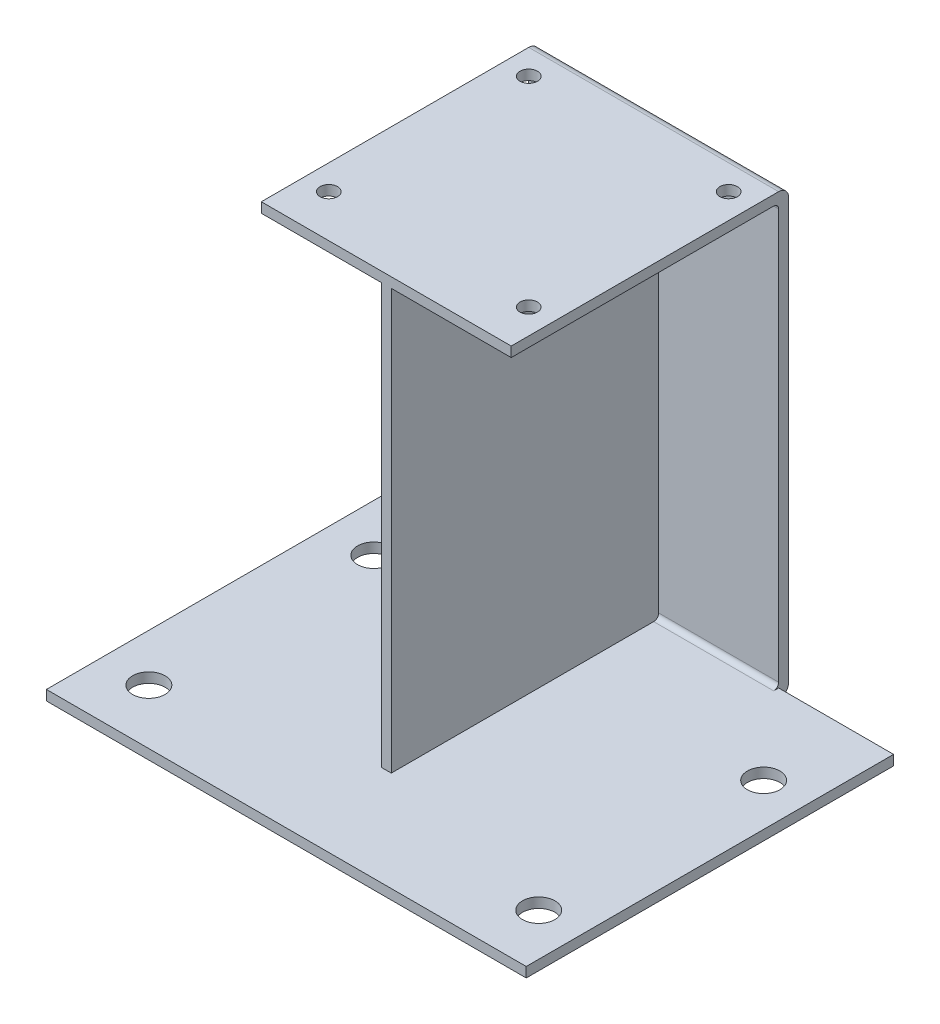
ISO-10303-21;
HEADER;
FILE_DESCRIPTION(('STEP AP214'),'2;1');
FILE_NAME('part.step','',(''),(''),'','','');
FILE_SCHEMA(('AUTOMOTIVE_DESIGN { 1 0 10303 214 1 1 1 1 }'));
ENDSEC;
DATA;
#1=APPLICATION_CONTEXT('core data for automotive mechanical design processes');
#2=APPLICATION_PROTOCOL_DEFINITION('international standard','automotive_design',2000,#1);
#3=PRODUCT_CONTEXT('',#1,'mechanical');
#4=PRODUCT('Part','Part','',(#3));
#5=PRODUCT_RELATED_PRODUCT_CATEGORY('part','',(#4));
#6=PRODUCT_DEFINITION_FORMATION('','',#4);
#7=PRODUCT_DEFINITION_CONTEXT('part definition',#1,'design');
#8=PRODUCT_DEFINITION('design','',#6,#7);
#9=PRODUCT_DEFINITION_SHAPE('','',#8);
#10=(LENGTH_UNIT() NAMED_UNIT(*) SI_UNIT(.MILLI.,.METRE.));
#11=(NAMED_UNIT(*) PLANE_ANGLE_UNIT() SI_UNIT($,.RADIAN.));
#12=(NAMED_UNIT(*) SI_UNIT($,.STERADIAN.) SOLID_ANGLE_UNIT());
#13=UNCERTAINTY_MEASURE_WITH_UNIT(LENGTH_MEASURE(1.E-05),#10,'distance_accuracy_value','');
#14=(GEOMETRIC_REPRESENTATION_CONTEXT(3) GLOBAL_UNCERTAINTY_ASSIGNED_CONTEXT((#13)) GLOBAL_UNIT_ASSIGNED_CONTEXT((#10,
#11,#12)) REPRESENTATION_CONTEXT('',''));
#15=CARTESIAN_POINT('',(0.,0.,0.));
#16=DIRECTION('',(0.,0.,1.));
#17=DIRECTION('',(1.,0.,0.));
#18=AXIS2_PLACEMENT_3D('',#15,#16,#17);
#19=CARTESIAN_POINT('',(0.,7.,0.));
#20=DIRECTION('',(0.,-1.,0.));
#21=DIRECTION('',(0.,0.,-1.));
#22=AXIS2_PLACEMENT_3D('',#19,#20,#21);
#23=PLANE('',#22);
#24=CARTESIAN_POINT('',(-20.,7.,-1.5));
#25=DIRECTION('',(0.,1.,0.));
#26=DIRECTION('',(0.,0.,1.));
#27=AXIS2_PLACEMENT_3D('',#24,#25,#26);
#28=CIRCLE('',#27,1.75);
#29=CARTESIAN_POINT('',(-20.,7.,0.25));
#30=VERTEX_POINT('',#29);
#31=EDGE_CURVE('E248',#30,#30,#28,.T.);
#32=ORIENTED_EDGE('',*,*,#31,.T.);
#33=EDGE_LOOP('',(#32));
#34=FACE_BOUND('',#33,.T.);
#35=CARTESIAN_POINT('',(-20.,7.,-41.5));
#36=DIRECTION('',(0.,1.,0.));
#37=DIRECTION('',(0.,0.,1.));
#38=AXIS2_PLACEMENT_3D('',#35,#36,#37);
#39=CIRCLE('',#38,1.75);
#40=CARTESIAN_POINT('',(-20.,7.,-39.75));
#41=VERTEX_POINT('',#40);
#42=EDGE_CURVE('E240',#41,#41,#39,.T.);
#43=ORIENTED_EDGE('',*,*,#42,.T.);
#44=EDGE_LOOP('',(#43));
#45=FACE_BOUND('',#44,.T.);
#46=DIRECTION('',(0.,0.,1.));
#47=VECTOR('',#46,1.);
#48=CARTESIAN_POINT('',(-1.,7.,-23.));
#49=LINE('',#48,#47);
#50=CARTESIAN_POINT('',(-1.,7.,-45.5));
#51=VERTEX_POINT('',#50);
#52=CARTESIAN_POINT('',(-0.999999999999987,7.,7.));
#53=VERTEX_POINT('',#52);
#54=EDGE_CURVE('E203',#51,#53,#49,.T.);
#55=ORIENTED_EDGE('',*,*,#54,.T.);
#56=DIRECTION('',(-1.,0.,0.));
#57=VECTOR('',#56,1.);
#58=CARTESIAN_POINT('',(0.,7.,7.));
#59=LINE('',#58,#57);
#60=CARTESIAN_POINT('',(-25.,7.,7.));
#61=VERTEX_POINT('',#60);
#62=EDGE_CURVE('E432',#53,#61,#59,.T.);
#63=ORIENTED_EDGE('',*,*,#62,.T.);
#64=DIRECTION('',(0.,0.,-1.));
#65=VECTOR('',#64,1.);
#66=CARTESIAN_POINT('',(-25.,7.,25.));
#67=LINE('',#66,#65);
#68=CARTESIAN_POINT('',(-25.,7.,-45.5));
#69=VERTEX_POINT('',#68);
#70=EDGE_CURVE('E200',#61,#69,#67,.T.);
#71=ORIENTED_EDGE('',*,*,#70,.T.);
#72=DIRECTION('',(1.,0.,0.));
#73=VECTOR('',#72,1.);
#74=CARTESIAN_POINT('',(25.,7.,-45.5));
#75=LINE('',#74,#73);
#76=EDGE_CURVE('E280',#69,#51,#75,.T.);
#77=ORIENTED_EDGE('',*,*,#76,.T.);
#78=EDGE_LOOP('',(#55,#63,#71,#77));
#79=FACE_BOUND('',#78,.T.);
#80=ADVANCED_FACE('F17',(#34,#45,#79),#23,.T.);
#81=CARTESIAN_POINT('',(-25.,2.,25.));
#82=DIRECTION('',(-1.,0.,0.));
#83=DIRECTION('',(0.,0.,1.));
#84=AXIS2_PLACEMENT_3D('',#81,#82,#83);
#85=PLANE('',#84);
#86=ORIENTED_EDGE('',*,*,#70,.F.);
#87=DIRECTION('',(0.,1.,0.));
#88=VECTOR('',#87,1.);
#89=CARTESIAN_POINT('',(-25.,2.,7.));
#90=LINE('',#89,#88);
#91=CARTESIAN_POINT('',(-25.,9.,7.));
#92=VERTEX_POINT('',#91);
#93=EDGE_CURVE('E32',#61,#92,#90,.T.);
#94=ORIENTED_EDGE('',*,*,#93,.T.);
#95=DIRECTION('',(0.,0.,-1.));
#96=VECTOR('',#95,1.);
#97=CARTESIAN_POINT('',(-25.,9.,25.));
#98=LINE('',#97,#96);
#99=CARTESIAN_POINT('',(-25.,9.,-46.5));
#100=VERTEX_POINT('',#99);
#101=EDGE_CURVE('E199',#92,#100,#98,.T.);
#102=ORIENTED_EDGE('',*,*,#101,.T.);
#103=CARTESIAN_POINT('',(-25.,7.,-46.5));
#104=DIRECTION('',(-1.,0.,0.));
#105=DIRECTION('',(0.,0.,1.));
#106=AXIS2_PLACEMENT_3D('',#103,#104,#105);
#107=CIRCLE('',#106,2.);
#108=CARTESIAN_POINT('',(-25.,7.,-48.5));
#109=VERTEX_POINT('',#108);
#110=EDGE_CURVE('E312',#100,#109,#107,.T.);
#111=ORIENTED_EDGE('',*,*,#110,.T.);
#112=DIRECTION('',(0.,-1.,0.));
#113=VECTOR('',#112,1.);
#114=CARTESIAN_POINT('',(-25.,2.,-48.5));
#115=LINE('',#114,#113);
#116=CARTESIAN_POINT('',(-25.,-77.,-48.5));
#117=VERTEX_POINT('',#116);
#118=EDGE_CURVE('E202',#109,#117,#115,.T.);
#119=ORIENTED_EDGE('',*,*,#118,.T.);
#120=CARTESIAN_POINT('',(-25.,-77.,-46.5));
#121=DIRECTION('',(-1.,0.,0.));
#122=DIRECTION('',(0.,0.,1.));
#123=AXIS2_PLACEMENT_3D('',#120,#121,#122);
#124=CIRCLE('',#123,2.);
#125=CARTESIAN_POINT('',(-25.,-79.,-46.5));
#126=VERTEX_POINT('',#125);
#127=EDGE_CURVE('E270',#117,#126,#124,.T.);
#128=ORIENTED_EDGE('',*,*,#127,.T.);
#129=DIRECTION('',(0.,1.,0.));
#130=VECTOR('',#129,1.);
#131=CARTESIAN_POINT('',(-25.,2.,-46.5));
#132=LINE('',#131,#130);
#133=CARTESIAN_POINT('',(-25.,-77.,-46.5));
#134=VERTEX_POINT('',#133);
#135=EDGE_CURVE('E300',#126,#134,#132,.T.);
#136=ORIENTED_EDGE('',*,*,#135,.T.);
#137=DIRECTION('',(0.,0.,-1.));
#138=VECTOR('',#137,1.);
#139=CARTESIAN_POINT('',(-25.,-77.,25.));
#140=LINE('',#139,#138);
#141=CARTESIAN_POINT('',(-25.,-77.,-45.5));
#142=VERTEX_POINT('',#141);
#143=EDGE_CURVE('E187',#142,#134,#140,.T.);
#144=ORIENTED_EDGE('',*,*,#143,.F.);
#145=CARTESIAN_POINT('',(-25.,-76.,-45.5));
#146=DIRECTION('',(-1.,0.,0.));
#147=DIRECTION('',(0.,0.,1.));
#148=AXIS2_PLACEMENT_3D('',#145,#146,#147);
#149=CIRCLE('',#148,1.);
#150=CARTESIAN_POINT('',(-25.,-76.,-46.5));
#151=VERTEX_POINT('',#150);
#152=EDGE_CURVE('E287',#142,#151,#149,.F.);
#153=ORIENTED_EDGE('',*,*,#152,.T.);
#154=DIRECTION('',(0.,1.,0.));
#155=VECTOR('',#154,1.);
#156=CARTESIAN_POINT('',(-25.,-70.,-46.5));
#157=LINE('',#156,#155);
#158=CARTESIAN_POINT('',(-25.,6.,-46.5));
#159=VERTEX_POINT('',#158);
#160=EDGE_CURVE('E215',#151,#159,#157,.T.);
#161=ORIENTED_EDGE('',*,*,#160,.T.);
#162=CARTESIAN_POINT('',(-25.,6.,-45.5));
#163=DIRECTION('',(-1.,0.,0.));
#164=DIRECTION('',(0.,0.,1.));
#165=AXIS2_PLACEMENT_3D('',#162,#163,#164);
#166=CIRCLE('',#165,1.);
#167=EDGE_CURVE('E284',#159,#69,#166,.F.);
#168=ORIENTED_EDGE('',*,*,#167,.T.);
#169=EDGE_LOOP('',(#86,#94,#102,#111,#119,#128,#136,#144,#153,#161,#168));
#170=FACE_BOUND('',#169,.T.);
#171=ADVANCED_FACE('F387',(#170),#85,.T.);
#172=CARTESIAN_POINT('',(20.,7.,-1.5));
#173=DIRECTION('',(0.,1.,0.));
#174=DIRECTION('',(0.,0.,1.));
#175=AXIS2_PLACEMENT_3D('',#172,#173,#174);
#176=CIRCLE('',#175,1.75);
#177=CARTESIAN_POINT('',(20.,7.,0.25));
#178=VERTEX_POINT('',#177);
#179=EDGE_CURVE('E255',#178,#178,#176,.T.);
#180=ORIENTED_EDGE('',*,*,#179,.T.);
#181=EDGE_LOOP('',(#180));
#182=FACE_BOUND('',#181,.T.);
#183=CARTESIAN_POINT('',(20.,7.,-41.5));
#184=DIRECTION('',(0.,1.,0.));
#185=DIRECTION('',(0.,0.,1.));
#186=AXIS2_PLACEMENT_3D('',#183,#184,#185);
#187=CIRCLE('',#186,1.75);
#188=CARTESIAN_POINT('',(20.,7.,-39.75));
#189=VERTEX_POINT('',#188);
#190=EDGE_CURVE('E262',#189,#189,#187,.T.);
#191=ORIENTED_EDGE('',*,*,#190,.T.);
#192=EDGE_LOOP('',(#191));
#193=FACE_BOUND('',#192,.T.);
#194=DIRECTION('',(0.,0.,1.));
#195=VECTOR('',#194,1.);
#196=CARTESIAN_POINT('',(25.,7.,-25.));
#197=LINE('',#196,#195);
#198=CARTESIAN_POINT('',(25.,7.,-45.5));
#199=VERTEX_POINT('',#198);
#200=CARTESIAN_POINT('',(25.,7.,7.));
#201=VERTEX_POINT('',#200);
#202=EDGE_CURVE('E209',#199,#201,#197,.T.);
#203=ORIENTED_EDGE('',*,*,#202,.T.);
#204=DIRECTION('',(-1.,0.,0.));
#205=VECTOR('',#204,1.);
#206=CARTESIAN_POINT('',(0.,7.,7.));
#207=LINE('',#206,#205);
#208=CARTESIAN_POINT('',(1.,7.,7.));
#209=VERTEX_POINT('',#208);
#210=EDGE_CURVE('E413',#201,#209,#207,.T.);
#211=ORIENTED_EDGE('',*,*,#210,.T.);
#212=DIRECTION('',(0.,0.,1.));
#213=VECTOR('',#212,1.);
#214=CARTESIAN_POINT('',(1.,7.,-23.));
#215=LINE('',#214,#213);
#216=CARTESIAN_POINT('',(1.,7.,-45.5));
#217=VERTEX_POINT('',#216);
#218=EDGE_CURVE('E41',#217,#209,#215,.T.);
#219=ORIENTED_EDGE('',*,*,#218,.F.);
#220=DIRECTION('',(1.,0.,0.));
#221=VECTOR('',#220,1.);
#222=CARTESIAN_POINT('',(25.,7.,-45.5));
#223=LINE('',#222,#221);
#224=EDGE_CURVE('E278',#217,#199,#223,.T.);
#225=ORIENTED_EDGE('',*,*,#224,.T.);
#226=EDGE_LOOP('',(#203,#211,#219,#225));
#227=FACE_BOUND('',#226,.T.);
#228=ADVANCED_FACE('F390',(#182,#193,#227),#23,.T.);
#229=CARTESIAN_POINT('',(25.,2.,-25.));
#230=DIRECTION('',(1.,0.,0.));
#231=DIRECTION('',(0.,0.,-1.));
#232=AXIS2_PLACEMENT_3D('',#229,#230,#231);
#233=PLANE('',#232);
#234=DIRECTION('',(0.,0.,1.));
#235=VECTOR('',#234,1.);
#236=CARTESIAN_POINT('',(25.,9.,-25.));
#237=LINE('',#236,#235);
#238=CARTESIAN_POINT('',(25.,9.,-46.5));
#239=VERTEX_POINT('',#238);
#240=CARTESIAN_POINT('',(25.,9.,7.));
#241=VERTEX_POINT('',#240);
#242=EDGE_CURVE('E196',#239,#241,#237,.T.);
#243=ORIENTED_EDGE('',*,*,#242,.T.);
#244=DIRECTION('',(0.,-1.,0.));
#245=VECTOR('',#244,1.);
#246=CARTESIAN_POINT('',(25.,2.,7.));
#247=LINE('',#246,#245);
#248=EDGE_CURVE('E421',#241,#201,#247,.T.);
#249=ORIENTED_EDGE('',*,*,#248,.T.);
#250=ORIENTED_EDGE('',*,*,#202,.F.);
#251=CARTESIAN_POINT('',(25.,6.,-45.5));
#252=DIRECTION('',(1.,0.,0.));
#253=DIRECTION('',(0.,0.,-1.));
#254=AXIS2_PLACEMENT_3D('',#251,#252,#253);
#255=CIRCLE('',#254,1.);
#256=CARTESIAN_POINT('',(25.,6.,-46.5));
#257=VERTEX_POINT('',#256);
#258=EDGE_CURVE('E266',#199,#257,#255,.F.);
#259=ORIENTED_EDGE('',*,*,#258,.T.);
#260=DIRECTION('',(0.,-1.,0.));
#261=VECTOR('',#260,1.);
#262=CARTESIAN_POINT('',(25.,2.,-46.5));
#263=LINE('',#262,#261);
#264=CARTESIAN_POINT('',(25.,-76.,-46.5));
#265=VERTEX_POINT('',#264);
#266=EDGE_CURVE('E164',#265,#257,#263,.F.);
#267=ORIENTED_EDGE('',*,*,#266,.F.);
#268=CARTESIAN_POINT('',(25.,-76.,-45.5));
#269=DIRECTION('',(1.,0.,0.));
#270=DIRECTION('',(0.,0.,-1.));
#271=AXIS2_PLACEMENT_3D('',#268,#269,#270);
#272=CIRCLE('',#271,1.);
#273=CARTESIAN_POINT('',(25.,-77.,-45.5));
#274=VERTEX_POINT('',#273);
#275=EDGE_CURVE('E194',#265,#274,#272,.F.);
#276=ORIENTED_EDGE('',*,*,#275,.T.);
#277=DIRECTION('',(0.,0.,1.));
#278=VECTOR('',#277,1.);
#279=CARTESIAN_POINT('',(25.,-77.,-25.));
#280=LINE('',#279,#278);
#281=CARTESIAN_POINT('',(25.,-77.,-46.5));
#282=VERTEX_POINT('',#281);
#283=EDGE_CURVE('E191',#282,#274,#280,.T.);
#284=ORIENTED_EDGE('',*,*,#283,.F.);
#285=DIRECTION('',(0.,1.,0.));
#286=VECTOR('',#285,1.);
#287=CARTESIAN_POINT('',(25.,2.,-46.5));
#288=LINE('',#287,#286);
#289=CARTESIAN_POINT('',(25.,-79.,-46.5));
#290=VERTEX_POINT('',#289);
#291=EDGE_CURVE('E176',#290,#282,#288,.T.);
#292=ORIENTED_EDGE('',*,*,#291,.F.);
#293=CARTESIAN_POINT('',(25.,-77.,-46.5));
#294=DIRECTION('',(1.,0.,0.));
#295=DIRECTION('',(0.,0.,-1.));
#296=AXIS2_PLACEMENT_3D('',#293,#294,#295);
#297=CIRCLE('',#296,2.);
#298=CARTESIAN_POINT('',(25.,-77.,-48.5));
#299=VERTEX_POINT('',#298);
#300=EDGE_CURVE('E295',#290,#299,#297,.T.);
#301=ORIENTED_EDGE('',*,*,#300,.T.);
#302=DIRECTION('',(0.,-1.,0.));
#303=VECTOR('',#302,1.);
#304=CARTESIAN_POINT('',(25.,2.,-48.5));
#305=LINE('',#304,#303);
#306=CARTESIAN_POINT('',(25.,7.,-48.5));
#307=VERTEX_POINT('',#306);
#308=EDGE_CURVE('E281',#307,#299,#305,.T.);
#309=ORIENTED_EDGE('',*,*,#308,.F.);
#310=CARTESIAN_POINT('',(25.,7.,-46.5));
#311=DIRECTION('',(1.,0.,0.));
#312=DIRECTION('',(0.,0.,-1.));
#313=AXIS2_PLACEMENT_3D('',#310,#311,#312);
#314=CIRCLE('',#313,2.);
#315=EDGE_CURVE('E299',#307,#239,#314,.T.);
#316=ORIENTED_EDGE('',*,*,#315,.T.);
#317=EDGE_LOOP('',(#243,#249,#250,#259,#267,#276,#284,#292,#301,#309,#316));
#318=FACE_BOUND('',#317,.T.);
#319=ADVANCED_FACE('F371',(#318),#233,.T.);
#320=CARTESIAN_POINT('',(0.,9.,0.));
#321=DIRECTION('',(0.,-1.,0.));
#322=DIRECTION('',(0.,0.,-1.));
#323=AXIS2_PLACEMENT_3D('',#320,#321,#322);
#324=PLANE('',#323);
#325=CARTESIAN_POINT('',(20.,9.,-41.5));
#326=DIRECTION('',(0.,-1.,0.));
#327=DIRECTION('',(0.,0.,-1.));
#328=AXIS2_PLACEMENT_3D('',#325,#326,#327);
#329=CIRCLE('',#328,1.75);
#330=CARTESIAN_POINT('',(20.,9.,-43.25));
#331=VERTEX_POINT('',#330);
#332=EDGE_CURVE('E185',#331,#331,#329,.F.);
#333=ORIENTED_EDGE('',*,*,#332,.F.);
#334=EDGE_LOOP('',(#333));
#335=FACE_BOUND('',#334,.T.);
#336=CARTESIAN_POINT('',(20.,9.,-1.5));
#337=DIRECTION('',(0.,-1.,0.));
#338=DIRECTION('',(0.,0.,-1.));
#339=AXIS2_PLACEMENT_3D('',#336,#337,#338);
#340=CIRCLE('',#339,1.75);
#341=CARTESIAN_POINT('',(20.,9.,-3.25));
#342=VERTEX_POINT('',#341);
#343=EDGE_CURVE('E259',#342,#342,#340,.F.);
#344=ORIENTED_EDGE('',*,*,#343,.F.);
#345=EDGE_LOOP('',(#344));
#346=FACE_BOUND('',#345,.T.);
#347=CARTESIAN_POINT('',(-20.,9.,-1.5));
#348=DIRECTION('',(0.,-1.,0.));
#349=DIRECTION('',(0.,0.,-1.));
#350=AXIS2_PLACEMENT_3D('',#347,#348,#349);
#351=CIRCLE('',#350,1.75);
#352=CARTESIAN_POINT('',(-20.,9.,-3.25));
#353=VERTEX_POINT('',#352);
#354=EDGE_CURVE('E252',#353,#353,#351,.F.);
#355=ORIENTED_EDGE('',*,*,#354,.F.);
#356=EDGE_LOOP('',(#355));
#357=FACE_BOUND('',#356,.T.);
#358=CARTESIAN_POINT('',(-20.,9.,-41.5));
#359=DIRECTION('',(0.,-1.,0.));
#360=DIRECTION('',(0.,0.,-1.));
#361=AXIS2_PLACEMENT_3D('',#358,#359,#360);
#362=CIRCLE('',#361,1.75);
#363=CARTESIAN_POINT('',(-20.,9.,-43.25));
#364=VERTEX_POINT('',#363);
#365=EDGE_CURVE('E244',#364,#364,#362,.F.);
#366=ORIENTED_EDGE('',*,*,#365,.F.);
#367=EDGE_LOOP('',(#366));
#368=FACE_BOUND('',#367,.T.);
#369=DIRECTION('',(-1.,0.,0.));
#370=VECTOR('',#369,1.);
#371=CARTESIAN_POINT('',(0.,9.,7.));
#372=LINE('',#371,#370);
#373=EDGE_CURVE('E424',#241,#92,#372,.T.);
#374=ORIENTED_EDGE('',*,*,#373,.F.);
#375=ORIENTED_EDGE('',*,*,#242,.F.);
#376=DIRECTION('',(1.,0.,0.));
#377=VECTOR('',#376,1.);
#378=CARTESIAN_POINT('',(-25.,9.,-46.5));
#379=LINE('',#378,#377);
#380=EDGE_CURVE('E320',#239,#100,#379,.F.);
#381=ORIENTED_EDGE('',*,*,#380,.T.);
#382=ORIENTED_EDGE('',*,*,#101,.F.);
#383=EDGE_LOOP('',(#374,#375,#381,#382));
#384=FACE_BOUND('',#383,.T.);
#385=ADVANCED_FACE('F404',(#335,#346,#357,#368,#384),#324,.F.);
#386=CARTESIAN_POINT('',(-0.999999999999985,-77.,-23.));
#387=DIRECTION('',(1.,0.,0.));
#388=DIRECTION('',(0.,1.,0.));
#389=AXIS2_PLACEMENT_3D('',#386,#387,#388);
#390=PLANE('',#389);
#391=DIRECTION('',(0.,-1.,0.));
#392=VECTOR('',#391,1.);
#393=CARTESIAN_POINT('',(-0.999999999999985,-77.,7.));
#394=LINE('',#393,#392);
#395=CARTESIAN_POINT('',(-0.999999999999988,-77.,7.));
#396=VERTEX_POINT('',#395);
#397=EDGE_CURVE('E331',#53,#396,#394,.T.);
#398=ORIENTED_EDGE('',*,*,#397,.F.);
#399=ORIENTED_EDGE('',*,*,#54,.F.);
#400=CARTESIAN_POINT('',(-1.,6.,-45.5));
#401=DIRECTION('',(1.,0.,0.));
#402=DIRECTION('',(0.,1.,0.));
#403=AXIS2_PLACEMENT_3D('',#400,#401,#402);
#404=CIRCLE('',#403,1.);
#405=CARTESIAN_POINT('',(-1.,6.,-46.5));
#406=VERTEX_POINT('',#405);
#407=EDGE_CURVE('E231',#51,#406,#404,.F.);
#408=ORIENTED_EDGE('',*,*,#407,.T.);
#409=DIRECTION('',(0.,1.,0.));
#410=VECTOR('',#409,1.);
#411=CARTESIAN_POINT('',(-0.999999999999985,-77.,-46.5));
#412=LINE('',#411,#410);
#413=CARTESIAN_POINT('',(-0.999999999999987,-76.,-46.5));
#414=VERTEX_POINT('',#413);
#415=EDGE_CURVE('E274',#414,#406,#412,.T.);
#416=ORIENTED_EDGE('',*,*,#415,.F.);
#417=CARTESIAN_POINT('',(-0.999999999999985,-76.,-45.5));
#418=DIRECTION('',(1.,0.,0.));
#419=DIRECTION('',(0.,1.,0.));
#420=AXIS2_PLACEMENT_3D('',#417,#418,#419);
#421=CIRCLE('',#420,1.);
#422=CARTESIAN_POINT('',(-0.999999999999985,-77.,-45.5));
#423=VERTEX_POINT('',#422);
#424=EDGE_CURVE('E25',#414,#423,#421,.F.);
#425=ORIENTED_EDGE('',*,*,#424,.T.);
#426=DIRECTION('',(0.,0.,1.));
#427=VECTOR('',#426,1.);
#428=CARTESIAN_POINT('',(-0.999999999999985,-77.,-23.));
#429=LINE('',#428,#427);
#430=EDGE_CURVE('E206',#423,#396,#429,.T.);
#431=ORIENTED_EDGE('',*,*,#430,.T.);
#432=EDGE_LOOP('',(#398,#399,#408,#416,#425,#431));
#433=FACE_BOUND('',#432,.T.);
#434=ADVANCED_FACE('F466',(#433),#390,.F.);
#435=CARTESIAN_POINT('',(1.,0.,-23.));
#436=DIRECTION('',(-1.,0.,0.));
#437=DIRECTION('',(0.,-1.,0.));
#438=AXIS2_PLACEMENT_3D('',#435,#436,#437);
#439=PLANE('',#438);
#440=DIRECTION('',(0.,1.,0.));
#441=VECTOR('',#440,1.);
#442=CARTESIAN_POINT('',(1.,0.,7.));
#443=LINE('',#442,#441);
#444=CARTESIAN_POINT('',(1.00000000000001,-77.,7.));
#445=VERTEX_POINT('',#444);
#446=EDGE_CURVE('E11',#445,#209,#443,.T.);
#447=ORIENTED_EDGE('',*,*,#446,.F.);
#448=DIRECTION('',(0.,0.,1.));
#449=VECTOR('',#448,1.);
#450=CARTESIAN_POINT('',(1.00000000000001,-77.,-23.));
#451=LINE('',#450,#449);
#452=CARTESIAN_POINT('',(1.00000000000001,-77.,-45.5));
#453=VERTEX_POINT('',#452);
#454=EDGE_CURVE('E211',#453,#445,#451,.T.);
#455=ORIENTED_EDGE('',*,*,#454,.F.);
#456=CARTESIAN_POINT('',(1.00000000000001,-76.,-45.5));
#457=DIRECTION('',(-1.,0.,0.));
#458=DIRECTION('',(0.,-1.,0.));
#459=AXIS2_PLACEMENT_3D('',#456,#457,#458);
#460=CIRCLE('',#459,1.);
#461=CARTESIAN_POINT('',(1.00000000000001,-76.,-46.5));
#462=VERTEX_POINT('',#461);
#463=EDGE_CURVE('E290',#453,#462,#460,.F.);
#464=ORIENTED_EDGE('',*,*,#463,.T.);
#465=DIRECTION('',(0.,-1.,0.));
#466=VECTOR('',#465,1.);
#467=CARTESIAN_POINT('',(1.,0.,-46.5));
#468=LINE('',#467,#466);
#469=CARTESIAN_POINT('',(1.,6.,-46.5));
#470=VERTEX_POINT('',#469);
#471=EDGE_CURVE('E271',#470,#462,#468,.T.);
#472=ORIENTED_EDGE('',*,*,#471,.F.);
#473=CARTESIAN_POINT('',(1.,6.,-45.5));
#474=DIRECTION('',(-1.,0.,0.));
#475=DIRECTION('',(0.,-1.,0.));
#476=AXIS2_PLACEMENT_3D('',#473,#474,#475);
#477=CIRCLE('',#476,1.);
#478=EDGE_CURVE('E275',#470,#217,#477,.F.);
#479=ORIENTED_EDGE('',*,*,#478,.T.);
#480=ORIENTED_EDGE('',*,*,#218,.T.);
#481=EDGE_LOOP('',(#447,#455,#464,#472,#479,#480));
#482=FACE_BOUND('',#481,.T.);
#483=ADVANCED_FACE('F484',(#482),#439,.F.);
#484=CARTESIAN_POINT('',(0.,-70.,-46.5));
#485=DIRECTION('',(0.,0.,1.));
#486=DIRECTION('',(1.,0.,0.));
#487=AXIS2_PLACEMENT_3D('',#484,#485,#486);
#488=PLANE('',#487);
#489=DIRECTION('',(1.,0.,0.));
#490=VECTOR('',#489,1.);
#491=CARTESIAN_POINT('',(25.,-76.,-46.5));
#492=LINE('',#491,#490);
#493=EDGE_CURVE('E190',#151,#414,#492,.T.);
#494=ORIENTED_EDGE('',*,*,#493,.T.);
#495=ORIENTED_EDGE('',*,*,#415,.T.);
#496=DIRECTION('',(1.,0.,0.));
#497=VECTOR('',#496,1.);
#498=CARTESIAN_POINT('',(-25.,6.,-46.5));
#499=LINE('',#498,#497);
#500=EDGE_CURVE('E267',#406,#159,#499,.F.);
#501=ORIENTED_EDGE('',*,*,#500,.T.);
#502=ORIENTED_EDGE('',*,*,#160,.F.);
#503=EDGE_LOOP('',(#494,#495,#501,#502));
#504=FACE_BOUND('',#503,.T.);
#505=ADVANCED_FACE('F518',(#504),#488,.T.);
#506=DIRECTION('',(1.,0.,0.));
#507=VECTOR('',#506,1.);
#508=CARTESIAN_POINT('',(-25.,6.,-46.5));
#509=LINE('',#508,#507);
#510=EDGE_CURVE('E263',#257,#470,#509,.F.);
#511=ORIENTED_EDGE('',*,*,#510,.T.);
#512=ORIENTED_EDGE('',*,*,#471,.T.);
#513=DIRECTION('',(1.,0.,0.));
#514=VECTOR('',#513,1.);
#515=CARTESIAN_POINT('',(25.,-76.,-46.5));
#516=LINE('',#515,#514);
#517=EDGE_CURVE('E268',#462,#265,#516,.T.);
#518=ORIENTED_EDGE('',*,*,#517,.T.);
#519=ORIENTED_EDGE('',*,*,#266,.T.);
#520=EDGE_LOOP('',(#511,#512,#518,#519));
#521=FACE_BOUND('',#520,.T.);
#522=ADVANCED_FACE('F524',(#521),#488,.T.);
#523=CARTESIAN_POINT('',(0.,6.,-45.5));
#524=DIRECTION('',(-1.,0.,0.));
#525=DIRECTION('',(0.,0.,1.));
#526=AXIS2_PLACEMENT_3D('',#523,#524,#525);
#527=CYLINDRICAL_SURFACE('',#526,1.);
#528=ORIENTED_EDGE('',*,*,#407,.F.);
#529=ORIENTED_EDGE('',*,*,#76,.F.);
#530=ORIENTED_EDGE('',*,*,#167,.F.);
#531=ORIENTED_EDGE('',*,*,#500,.F.);
#532=EDGE_LOOP('',(#528,#529,#530,#531));
#533=FACE_BOUND('',#532,.T.);
#534=ADVANCED_FACE('F521',(#533),#527,.F.);
#535=ORIENTED_EDGE('',*,*,#478,.F.);
#536=ORIENTED_EDGE('',*,*,#510,.F.);
#537=ORIENTED_EDGE('',*,*,#258,.F.);
#538=ORIENTED_EDGE('',*,*,#224,.F.);
#539=EDGE_LOOP('',(#535,#536,#537,#538));
#540=FACE_BOUND('',#539,.T.);
#541=ADVANCED_FACE('F523',(#540),#527,.F.);
#542=CARTESIAN_POINT('',(0.,-76.,-45.5));
#543=DIRECTION('',(-1.,0.,0.));
#544=DIRECTION('',(0.,0.,1.));
#545=AXIS2_PLACEMENT_3D('',#542,#543,#544);
#546=CYLINDRICAL_SURFACE('',#545,1.);
#547=ORIENTED_EDGE('',*,*,#424,.F.);
#548=ORIENTED_EDGE('',*,*,#493,.F.);
#549=ORIENTED_EDGE('',*,*,#152,.F.);
#550=DIRECTION('',(1.,0.,0.));
#551=VECTOR('',#550,1.);
#552=CARTESIAN_POINT('',(-25.,-77.,-45.5));
#553=LINE('',#552,#551);
#554=EDGE_CURVE('E189',#423,#142,#553,.F.);
#555=ORIENTED_EDGE('',*,*,#554,.F.);
#556=EDGE_LOOP('',(#547,#548,#549,#555));
#557=FACE_BOUND('',#556,.T.);
#558=ADVANCED_FACE('F514',(#557),#546,.F.);
#559=ORIENTED_EDGE('',*,*,#463,.F.);
#560=DIRECTION('',(1.,0.,0.));
#561=VECTOR('',#560,1.);
#562=CARTESIAN_POINT('',(-25.,-77.,-45.5));
#563=LINE('',#562,#561);
#564=EDGE_CURVE('E195',#274,#453,#563,.F.);
#565=ORIENTED_EDGE('',*,*,#564,.F.);
#566=ORIENTED_EDGE('',*,*,#275,.F.);
#567=ORIENTED_EDGE('',*,*,#517,.F.);
#568=EDGE_LOOP('',(#559,#565,#566,#567));
#569=FACE_BOUND('',#568,.T.);
#570=ADVANCED_FACE('F534',(#569),#546,.F.);
#571=CARTESIAN_POINT('',(-25.,2.,-48.5));
#572=DIRECTION('',(0.,0.,-1.));
#573=DIRECTION('',(-1.,0.,0.));
#574=AXIS2_PLACEMENT_3D('',#571,#572,#573);
#575=PLANE('',#574);
#576=ORIENTED_EDGE('',*,*,#308,.T.);
#577=DIRECTION('',(1.,0.,0.));
#578=VECTOR('',#577,1.);
#579=CARTESIAN_POINT('',(-25.,-77.,-48.5));
#580=LINE('',#579,#578);
#581=EDGE_CURVE('E293',#299,#117,#580,.F.);
#582=ORIENTED_EDGE('',*,*,#581,.T.);
#583=ORIENTED_EDGE('',*,*,#118,.F.);
#584=DIRECTION('',(1.,0.,0.));
#585=VECTOR('',#584,1.);
#586=CARTESIAN_POINT('',(25.,7.,-48.5));
#587=LINE('',#586,#585);
#588=EDGE_CURVE('E296',#109,#307,#587,.T.);
#589=ORIENTED_EDGE('',*,*,#588,.T.);
#590=EDGE_LOOP('',(#576,#582,#583,#589));
#591=FACE_BOUND('',#590,.T.);
#592=ADVANCED_FACE('F473',(#591),#575,.T.);
#593=CARTESIAN_POINT('',(25.,2.,27.));
#594=DIRECTION('',(0.,0.,1.));
#595=DIRECTION('',(1.,0.,0.));
#596=AXIS2_PLACEMENT_3D('',#593,#594,#595);
#597=PLANE('',#596);
#598=DIRECTION('',(0.,1.,0.));
#599=VECTOR('',#598,1.);
#600=CARTESIAN_POINT('',(48.,-79.,27.));
#601=LINE('',#600,#599);
#602=CARTESIAN_POINT('',(48.,-79.,27.));
#603=VERTEX_POINT('',#602);
#604=CARTESIAN_POINT('',(48.,-77.,27.));
#605=VERTEX_POINT('',#604);
#606=EDGE_CURVE('E350',#603,#605,#601,.T.);
#607=ORIENTED_EDGE('',*,*,#606,.T.);
#608=DIRECTION('',(1.,0.,0.));
#609=VECTOR('',#608,1.);
#610=CARTESIAN_POINT('',(0.,-77.,27.));
#611=LINE('',#610,#609);
#612=CARTESIAN_POINT('',(-48.,-77.,27.));
#613=VERTEX_POINT('',#612);
#614=EDGE_CURVE('E141',#613,#605,#611,.T.);
#615=ORIENTED_EDGE('',*,*,#614,.F.);
#616=DIRECTION('',(0.,-1.,0.));
#617=VECTOR('',#616,1.);
#618=CARTESIAN_POINT('',(-48.,-77.,27.));
#619=LINE('',#618,#617);
#620=CARTESIAN_POINT('',(-48.,-79.,27.));
#621=VERTEX_POINT('',#620);
#622=EDGE_CURVE('E167',#613,#621,#619,.T.);
#623=ORIENTED_EDGE('',*,*,#622,.T.);
#624=DIRECTION('',(-1.,0.,0.));
#625=VECTOR('',#624,1.);
#626=CARTESIAN_POINT('',(0.,-79.,27.));
#627=LINE('',#626,#625);
#628=EDGE_CURVE('E152',#621,#603,#627,.F.);
#629=ORIENTED_EDGE('',*,*,#628,.T.);
#630=EDGE_LOOP('',(#607,#615,#623,#629));
#631=FACE_BOUND('',#630,.T.);
#632=ADVANCED_FACE('F168',(#631),#597,.T.);
#633=CARTESIAN_POINT('',(0.,-79.,0.));
#634=DIRECTION('',(0.,-1.,0.));
#635=DIRECTION('',(0.,0.,-1.));
#636=AXIS2_PLACEMENT_3D('',#633,#634,#635);
#637=PLANE('',#636);
#638=CARTESIAN_POINT('',(39.5,-79.,16.));
#639=DIRECTION('',(0.,-1.,0.));
#640=DIRECTION('',(0.,0.,-1.));
#641=AXIS2_PLACEMENT_3D('',#638,#639,#640);
#642=CIRCLE('',#641,3.25);
#643=CARTESIAN_POINT('',(39.5,-79.,12.75));
#644=VERTEX_POINT('',#643);
#645=EDGE_CURVE('E224',#644,#644,#642,.F.);
#646=ORIENTED_EDGE('',*,*,#645,.T.);
#647=EDGE_LOOP('',(#646));
#648=FACE_BOUND('',#647,.T.);
#649=CARTESIAN_POINT('',(-38.5,-79.,16.));
#650=DIRECTION('',(0.,-1.,0.));
#651=DIRECTION('',(0.,0.,-1.));
#652=AXIS2_PLACEMENT_3D('',#649,#650,#651);
#653=CIRCLE('',#652,3.25);
#654=CARTESIAN_POINT('',(-38.5,-79.,12.75));
#655=VERTEX_POINT('',#654);
#656=EDGE_CURVE('E216',#655,#655,#653,.F.);
#657=ORIENTED_EDGE('',*,*,#656,.T.);
#658=EDGE_LOOP('',(#657));
#659=FACE_BOUND('',#658,.T.);
#660=CARTESIAN_POINT('',(-38.5,-79.,-29.));
#661=DIRECTION('',(0.,-1.,0.));
#662=DIRECTION('',(0.,0.,-1.));
#663=AXIS2_PLACEMENT_3D('',#660,#661,#662);
#664=CIRCLE('',#663,3.25);
#665=CARTESIAN_POINT('',(-38.5,-79.,-32.25));
#666=VERTEX_POINT('',#665);
#667=EDGE_CURVE('E239',#666,#666,#664,.F.);
#668=ORIENTED_EDGE('',*,*,#667,.T.);
#669=EDGE_LOOP('',(#668));
#670=FACE_BOUND('',#669,.T.);
#671=CARTESIAN_POINT('',(39.5,-79.,-29.));
#672=DIRECTION('',(0.,-1.,0.));
#673=DIRECTION('',(0.,0.,-1.));
#674=AXIS2_PLACEMENT_3D('',#671,#672,#673);
#675=CIRCLE('',#674,3.25);
#676=CARTESIAN_POINT('',(39.5,-79.,-32.25));
#677=VERTEX_POINT('',#676);
#678=EDGE_CURVE('E232',#677,#677,#675,.F.);
#679=ORIENTED_EDGE('',*,*,#678,.T.);
#680=EDGE_LOOP('',(#679));
#681=FACE_BOUND('',#680,.T.);
#682=DIRECTION('',(1.,0.,0.));
#683=VECTOR('',#682,1.);
#684=CARTESIAN_POINT('',(0.,-79.,-46.5));
#685=LINE('',#684,#683);
#686=CARTESIAN_POINT('',(-48.,-79.,-46.5));
#687=VERTEX_POINT('',#686);
#688=EDGE_CURVE('E245',#687,#126,#685,.T.);
#689=ORIENTED_EDGE('',*,*,#688,.T.);
#690=DIRECTION('',(1.,0.,0.));
#691=VECTOR('',#690,1.);
#692=CARTESIAN_POINT('',(0.,-79.,-46.5));
#693=LINE('',#692,#691);
#694=EDGE_CURVE('E309',#126,#290,#693,.T.);
#695=ORIENTED_EDGE('',*,*,#694,.T.);
#696=DIRECTION('',(-1.,0.,0.));
#697=VECTOR('',#696,1.);
#698=CARTESIAN_POINT('',(0.,-79.,-46.5));
#699=LINE('',#698,#697);
#700=CARTESIAN_POINT('',(48.,-79.,-46.5));
#701=VERTEX_POINT('',#700);
#702=EDGE_CURVE('E305',#701,#290,#699,.T.);
#703=ORIENTED_EDGE('',*,*,#702,.F.);
#704=DIRECTION('',(0.,0.,1.));
#705=VECTOR('',#704,1.);
#706=CARTESIAN_POINT('',(48.,-79.,-38.));
#707=LINE('',#706,#705);
#708=EDGE_CURVE('E160',#701,#603,#707,.T.);
#709=ORIENTED_EDGE('',*,*,#708,.T.);
#710=ORIENTED_EDGE('',*,*,#628,.F.);
#711=DIRECTION('',(0.,0.,-1.));
#712=VECTOR('',#711,1.);
#713=CARTESIAN_POINT('',(-48.,-79.,27.));
#714=LINE('',#713,#712);
#715=EDGE_CURVE('E157',#621,#687,#714,.T.);
#716=ORIENTED_EDGE('',*,*,#715,.T.);
#717=EDGE_LOOP('',(#689,#695,#703,#709,#710,#716));
#718=FACE_BOUND('',#717,.T.);
#719=ADVANCED_FACE('F155',(#648,#659,#670,#681,#718),#637,.T.);
#720=CARTESIAN_POINT('',(0.,-77.,25.));
#721=DIRECTION('',(0.,1.,0.));
#722=DIRECTION('',(0.,0.,1.));
#723=AXIS2_PLACEMENT_3D('',#720,#721,#722);
#724=PLANE('',#723);
#725=DIRECTION('',(1.,0.,0.));
#726=VECTOR('',#725,1.);
#727=CARTESIAN_POINT('',(-0.999999999999988,-77.,7.));
#728=LINE('',#727,#726);
#729=EDGE_CURVE('E427',#396,#445,#728,.T.);
#730=ORIENTED_EDGE('',*,*,#729,.F.);
#731=ORIENTED_EDGE('',*,*,#430,.F.);
#732=ORIENTED_EDGE('',*,*,#554,.T.);
#733=ORIENTED_EDGE('',*,*,#143,.T.);
#734=DIRECTION('',(-1.,0.,0.));
#735=VECTOR('',#734,1.);
#736=CARTESIAN_POINT('',(0.,-77.,-46.5));
#737=LINE('',#736,#735);
#738=CARTESIAN_POINT('',(-48.,-77.,-46.5));
#739=VERTEX_POINT('',#738);
#740=EDGE_CURVE('E304',#739,#134,#737,.F.);
#741=ORIENTED_EDGE('',*,*,#740,.F.);
#742=DIRECTION('',(0.,0.,1.));
#743=VECTOR('',#742,1.);
#744=CARTESIAN_POINT('',(-48.,-77.,-38.));
#745=LINE('',#744,#743);
#746=EDGE_CURVE('E171',#739,#613,#745,.T.);
#747=ORIENTED_EDGE('',*,*,#746,.T.);
#748=ORIENTED_EDGE('',*,*,#614,.T.);
#749=DIRECTION('',(0.,0.,-1.));
#750=VECTOR('',#749,1.);
#751=CARTESIAN_POINT('',(48.,-77.,27.));
#752=LINE('',#751,#750);
#753=CARTESIAN_POINT('',(48.,-77.,-46.5));
#754=VERTEX_POINT('',#753);
#755=EDGE_CURVE('E136',#605,#754,#752,.T.);
#756=ORIENTED_EDGE('',*,*,#755,.T.);
#757=DIRECTION('',(-1.,0.,0.));
#758=VECTOR('',#757,1.);
#759=CARTESIAN_POINT('',(28.,-77.,-46.5));
#760=LINE('',#759,#758);
#761=EDGE_CURVE('E180',#754,#282,#760,.T.);
#762=ORIENTED_EDGE('',*,*,#761,.T.);
#763=ORIENTED_EDGE('',*,*,#283,.T.);
#764=ORIENTED_EDGE('',*,*,#564,.T.);
#765=ORIENTED_EDGE('',*,*,#454,.T.);
#766=EDGE_LOOP('',(#730,#731,#732,#733,#741,#747,#748,#756,#762,#763,#764,#765));
#767=FACE_BOUND('',#766,.T.);
#768=CARTESIAN_POINT('',(-38.5,-77.,16.));
#769=DIRECTION('',(0.,-1.,0.));
#770=DIRECTION('',(1.,0.,0.));
#771=AXIS2_PLACEMENT_3D('',#768,#769,#770);
#772=CIRCLE('',#771,3.25);
#773=CARTESIAN_POINT('',(-35.25,-77.,16.));
#774=VERTEX_POINT('',#773);
#775=EDGE_CURVE('E220',#774,#774,#772,.T.);
#776=ORIENTED_EDGE('',*,*,#775,.T.);
#777=EDGE_LOOP('',(#776));
#778=FACE_BOUND('',#777,.T.);
#779=CARTESIAN_POINT('',(39.5,-77.,16.));
#780=DIRECTION('',(0.,-1.,0.));
#781=DIRECTION('',(1.,0.,0.));
#782=AXIS2_PLACEMENT_3D('',#779,#780,#781);
#783=CIRCLE('',#782,3.25);
#784=CARTESIAN_POINT('',(42.75,-77.,16.));
#785=VERTEX_POINT('',#784);
#786=EDGE_CURVE('E227',#785,#785,#783,.T.);
#787=ORIENTED_EDGE('',*,*,#786,.T.);
#788=EDGE_LOOP('',(#787));
#789=FACE_BOUND('',#788,.T.);
#790=CARTESIAN_POINT('',(-38.5,-77.,-29.));
#791=DIRECTION('',(0.,-1.,0.));
#792=DIRECTION('',(1.,0.,0.));
#793=AXIS2_PLACEMENT_3D('',#790,#791,#792);
#794=CIRCLE('',#793,3.25);
#795=CARTESIAN_POINT('',(-35.25,-77.,-29.));
#796=VERTEX_POINT('',#795);
#797=EDGE_CURVE('E219',#796,#796,#794,.T.);
#798=ORIENTED_EDGE('',*,*,#797,.T.);
#799=EDGE_LOOP('',(#798));
#800=FACE_BOUND('',#799,.T.);
#801=CARTESIAN_POINT('',(39.5,-77.,-29.));
#802=DIRECTION('',(0.,-1.,0.));
#803=DIRECTION('',(1.,0.,0.));
#804=AXIS2_PLACEMENT_3D('',#801,#802,#803);
#805=CIRCLE('',#804,3.25);
#806=CARTESIAN_POINT('',(42.75,-77.,-29.));
#807=VERTEX_POINT('',#806);
#808=EDGE_CURVE('E235',#807,#807,#805,.T.);
#809=ORIENTED_EDGE('',*,*,#808,.T.);
#810=EDGE_LOOP('',(#809));
#811=FACE_BOUND('',#810,.T.);
#812=ADVANCED_FACE('F361',(#767,#778,#789,#800,#811),#724,.T.);
#813=CARTESIAN_POINT('',(20.,9.27666646261489,-41.5));
#814=DIRECTION('',(0.,-1.,0.));
#815=DIRECTION('',(0.,0.,-1.));
#816=AXIS2_PLACEMENT_3D('',#813,#814,#815);
#817=CYLINDRICAL_SURFACE('',#816,1.75);
#818=ORIENTED_EDGE('',*,*,#190,.F.);
#819=EDGE_LOOP('',(#818));
#820=FACE_BOUND('',#819,.T.);
#821=ORIENTED_EDGE('',*,*,#332,.T.);
#822=EDGE_LOOP('',(#821));
#823=FACE_BOUND('',#822,.T.);
#824=ADVANCED_FACE('F476',(#820,#823),#817,.F.);
#825=CARTESIAN_POINT('',(20.,9.27666646261489,-1.5));
#826=DIRECTION('',(0.,-1.,0.));
#827=DIRECTION('',(0.,0.,-1.));
#828=AXIS2_PLACEMENT_3D('',#825,#826,#827);
#829=CYLINDRICAL_SURFACE('',#828,1.75);
#830=ORIENTED_EDGE('',*,*,#179,.F.);
#831=EDGE_LOOP('',(#830));
#832=FACE_BOUND('',#831,.T.);
#833=ORIENTED_EDGE('',*,*,#343,.T.);
#834=EDGE_LOOP('',(#833));
#835=FACE_BOUND('',#834,.T.);
#836=ADVANCED_FACE('F768',(#832,#835),#829,.F.);
#837=CARTESIAN_POINT('',(-20.,9.27666646261489,-1.5));
#838=DIRECTION('',(0.,-1.,0.));
#839=DIRECTION('',(0.,0.,-1.));
#840=AXIS2_PLACEMENT_3D('',#837,#838,#839);
#841=CYLINDRICAL_SURFACE('',#840,1.75);
#842=ORIENTED_EDGE('',*,*,#31,.F.);
#843=EDGE_LOOP('',(#842));
#844=FACE_BOUND('',#843,.T.);
#845=ORIENTED_EDGE('',*,*,#354,.T.);
#846=EDGE_LOOP('',(#845));
#847=FACE_BOUND('',#846,.T.);
#848=ADVANCED_FACE('F542',(#844,#847),#841,.F.);
#849=CARTESIAN_POINT('',(-20.,9.27666646261489,-41.5));
#850=DIRECTION('',(0.,-1.,0.));
#851=DIRECTION('',(0.,0.,-1.));
#852=AXIS2_PLACEMENT_3D('',#849,#850,#851);
#853=CYLINDRICAL_SURFACE('',#852,1.75);
#854=ORIENTED_EDGE('',*,*,#42,.F.);
#855=EDGE_LOOP('',(#854));
#856=FACE_BOUND('',#855,.T.);
#857=ORIENTED_EDGE('',*,*,#365,.T.);
#858=EDGE_LOOP('',(#857));
#859=FACE_BOUND('',#858,.T.);
#860=ADVANCED_FACE('F537',(#856,#859),#853,.F.);
#861=CARTESIAN_POINT('',(-25.,7.,-46.5));
#862=DIRECTION('',(-1.,0.,0.));
#863=DIRECTION('',(0.,0.,1.));
#864=AXIS2_PLACEMENT_3D('',#861,#862,#863);
#865=CYLINDRICAL_SURFACE('',#864,2.);
#866=ORIENTED_EDGE('',*,*,#110,.F.);
#867=ORIENTED_EDGE('',*,*,#380,.F.);
#868=ORIENTED_EDGE('',*,*,#315,.F.);
#869=ORIENTED_EDGE('',*,*,#588,.F.);
#870=EDGE_LOOP('',(#866,#867,#868,#869));
#871=FACE_BOUND('',#870,.T.);
#872=ADVANCED_FACE('F383',(#871),#865,.T.);
#873=CARTESIAN_POINT('',(-28.,2.,-46.5));
#874=DIRECTION('',(0.,0.,-1.));
#875=DIRECTION('',(-1.,0.,0.));
#876=AXIS2_PLACEMENT_3D('',#873,#874,#875);
#877=PLANE('',#876);
#878=ORIENTED_EDGE('',*,*,#135,.F.);
#879=ORIENTED_EDGE('',*,*,#688,.F.);
#880=DIRECTION('',(0.,1.,0.));
#881=VECTOR('',#880,1.);
#882=CARTESIAN_POINT('',(-48.,-79.,-46.5));
#883=LINE('',#882,#881);
#884=EDGE_CURVE('E175',#687,#739,#883,.T.);
#885=ORIENTED_EDGE('',*,*,#884,.T.);
#886=ORIENTED_EDGE('',*,*,#740,.T.);
#887=EDGE_LOOP('',(#878,#879,#885,#886));
#888=FACE_BOUND('',#887,.T.);
#889=ADVANCED_FACE('F365',(#888),#877,.T.);
#890=CARTESIAN_POINT('',(28.,2.,-46.5));
#891=DIRECTION('',(0.,0.,1.));
#892=DIRECTION('',(1.,0.,0.));
#893=AXIS2_PLACEMENT_3D('',#890,#891,#892);
#894=PLANE('',#893);
#895=ORIENTED_EDGE('',*,*,#291,.T.);
#896=ORIENTED_EDGE('',*,*,#761,.F.);
#897=DIRECTION('',(0.,-1.,0.));
#898=VECTOR('',#897,1.);
#899=CARTESIAN_POINT('',(48.,-77.,-46.5));
#900=LINE('',#899,#898);
#901=EDGE_CURVE('E351',#754,#701,#900,.T.);
#902=ORIENTED_EDGE('',*,*,#901,.T.);
#903=ORIENTED_EDGE('',*,*,#702,.T.);
#904=EDGE_LOOP('',(#895,#896,#902,#903));
#905=FACE_BOUND('',#904,.T.);
#906=ADVANCED_FACE('F373',(#905),#894,.F.);
#907=CARTESIAN_POINT('',(-48.,0.,0.));
#908=DIRECTION('',(1.,0.,0.));
#909=DIRECTION('',(0.,0.,-1.));
#910=AXIS2_PLACEMENT_3D('',#907,#908,#909);
#911=PLANE('',#910);
#912=ORIENTED_EDGE('',*,*,#884,.F.);
#913=ORIENTED_EDGE('',*,*,#715,.F.);
#914=ORIENTED_EDGE('',*,*,#622,.F.);
#915=ORIENTED_EDGE('',*,*,#746,.F.);
#916=EDGE_LOOP('',(#912,#913,#914,#915));
#917=FACE_BOUND('',#916,.T.);
#918=ADVANCED_FACE('F173',(#917),#911,.F.);
#919=CARTESIAN_POINT('',(48.,0.,0.));
#920=DIRECTION('',(-1.,0.,0.));
#921=DIRECTION('',(0.,0.,1.));
#922=AXIS2_PLACEMENT_3D('',#919,#920,#921);
#923=PLANE('',#922);
#924=ORIENTED_EDGE('',*,*,#755,.F.);
#925=ORIENTED_EDGE('',*,*,#606,.F.);
#926=ORIENTED_EDGE('',*,*,#708,.F.);
#927=ORIENTED_EDGE('',*,*,#901,.F.);
#928=EDGE_LOOP('',(#924,#925,#926,#927));
#929=FACE_BOUND('',#928,.T.);
#930=ADVANCED_FACE('F381',(#929),#923,.F.);
#931=CARTESIAN_POINT('',(0.,-77.,-46.5));
#932=DIRECTION('',(1.,0.,0.));
#933=DIRECTION('',(0.,0.,-1.));
#934=AXIS2_PLACEMENT_3D('',#931,#932,#933);
#935=CYLINDRICAL_SURFACE('',#934,2.);
#936=ORIENTED_EDGE('',*,*,#127,.F.);
#937=ORIENTED_EDGE('',*,*,#581,.F.);
#938=ORIENTED_EDGE('',*,*,#300,.F.);
#939=ORIENTED_EDGE('',*,*,#694,.F.);
#940=EDGE_LOOP('',(#936,#937,#938,#939));
#941=FACE_BOUND('',#940,.T.);
#942=ADVANCED_FACE('F19',(#941),#935,.T.);
#943=CARTESIAN_POINT('',(39.5,-86.6123738191882,-29.));
#944=DIRECTION('',(0.,1.,0.));
#945=DIRECTION('',(0.,0.,1.));
#946=AXIS2_PLACEMENT_3D('',#943,#944,#945);
#947=CYLINDRICAL_SURFACE('',#946,3.25);
#948=ORIENTED_EDGE('',*,*,#678,.F.);
#949=EDGE_LOOP('',(#948));
#950=FACE_BOUND('',#949,.T.);
#951=ORIENTED_EDGE('',*,*,#808,.F.);
#952=EDGE_LOOP('',(#951));
#953=FACE_BOUND('',#952,.T.);
#954=ADVANCED_FACE('F454',(#950,#953),#947,.F.);
#955=CARTESIAN_POINT('',(-38.5,-86.6123738191882,-29.));
#956=DIRECTION('',(0.,1.,0.));
#957=DIRECTION('',(0.,0.,1.));
#958=AXIS2_PLACEMENT_3D('',#955,#956,#957);
#959=CYLINDRICAL_SURFACE('',#958,3.25);
#960=ORIENTED_EDGE('',*,*,#667,.F.);
#961=EDGE_LOOP('',(#960));
#962=FACE_BOUND('',#961,.T.);
#963=ORIENTED_EDGE('',*,*,#797,.F.);
#964=EDGE_LOOP('',(#963));
#965=FACE_BOUND('',#964,.T.);
#966=ADVANCED_FACE('F450',(#962,#965),#959,.F.);
#967=CARTESIAN_POINT('',(-38.5,-86.6123738191882,16.));
#968=DIRECTION('',(0.,1.,0.));
#969=DIRECTION('',(0.,0.,1.));
#970=AXIS2_PLACEMENT_3D('',#967,#968,#969);
#971=CYLINDRICAL_SURFACE('',#970,3.25);
#972=ORIENTED_EDGE('',*,*,#656,.F.);
#973=EDGE_LOOP('',(#972));
#974=FACE_BOUND('',#973,.T.);
#975=ORIENTED_EDGE('',*,*,#775,.F.);
#976=EDGE_LOOP('',(#975));
#977=FACE_BOUND('',#976,.T.);
#978=ADVANCED_FACE('F453',(#974,#977),#971,.F.);
#979=CARTESIAN_POINT('',(39.5,-86.6123738191882,16.));
#980=DIRECTION('',(0.,1.,0.));
#981=DIRECTION('',(0.,0.,1.));
#982=AXIS2_PLACEMENT_3D('',#979,#980,#981);
#983=CYLINDRICAL_SURFACE('',#982,3.25);
#984=ORIENTED_EDGE('',*,*,#645,.F.);
#985=EDGE_LOOP('',(#984));
#986=FACE_BOUND('',#985,.T.);
#987=ORIENTED_EDGE('',*,*,#786,.F.);
#988=EDGE_LOOP('',(#987));
#989=FACE_BOUND('',#988,.T.);
#990=ADVANCED_FACE('F460',(#986,#989),#983,.F.);
#991=CARTESIAN_POINT('',(0.,-77.,7.));
#992=DIRECTION('',(0.,0.,1.));
#993=DIRECTION('',(1.,0.,0.));
#994=AXIS2_PLACEMENT_3D('',#991,#992,#993);
#995=PLANE('',#994);
#996=ORIENTED_EDGE('',*,*,#397,.T.);
#997=ORIENTED_EDGE('',*,*,#729,.T.);
#998=ORIENTED_EDGE('',*,*,#446,.T.);
#999=ORIENTED_EDGE('',*,*,#210,.F.);
#1000=ORIENTED_EDGE('',*,*,#248,.F.);
#1001=ORIENTED_EDGE('',*,*,#373,.T.);
#1002=ORIENTED_EDGE('',*,*,#93,.F.);
#1003=ORIENTED_EDGE('',*,*,#62,.F.);
#1004=EDGE_LOOP('',(#996,#997,#998,#999,#1000,#1001,#1002,#1003));
#1005=FACE_BOUND('',#1004,.T.);
#1006=ADVANCED_FACE('F498',(#1005),#995,.T.);
#1007=CLOSED_SHELL('',(#80,#171,#228,#319,#385,#434,#483,#505,#522,#534,#541,#558,#570,#592,
#632,#719,#812,#824,#836,#848,#860,#872,#889,#906,#918,#930,#942,#954,#966,#978,#990,#1006));
#1008=MANIFOLD_SOLID_BREP('B1',#1007);
#1009=ADVANCED_BREP_SHAPE_REPRESENTATION('',(#18,#1008),#14);
#1010=SHAPE_DEFINITION_REPRESENTATION(#9,#1009);
ENDSEC;
END-ISO-10303-21;
